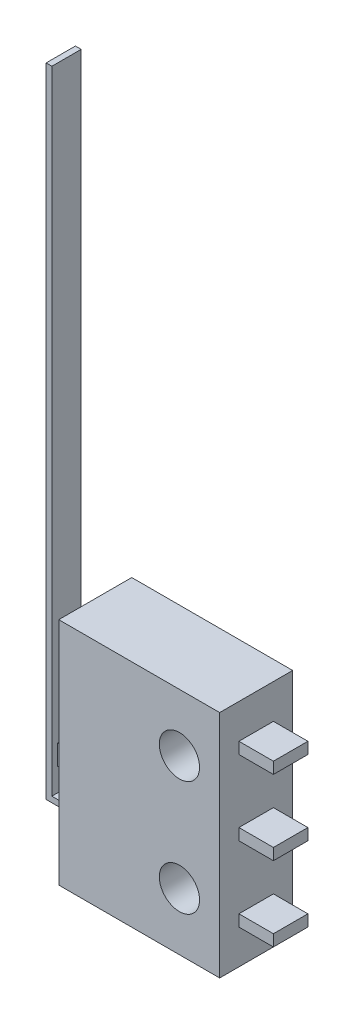
ISO-10303-21;
HEADER;
FILE_DESCRIPTION(('STEP AP214'),'2;1');
FILE_NAME('part.step','',(''),(''),'','','');
FILE_SCHEMA(('AUTOMOTIVE_DESIGN { 1 0 10303 214 1 1 1 1 }'));
ENDSEC;
DATA;
#1=APPLICATION_CONTEXT('core data for automotive mechanical design processes');
#2=APPLICATION_PROTOCOL_DEFINITION('international standard','automotive_design',2000,#1);
#3=PRODUCT_CONTEXT('',#1,'mechanical');
#4=PRODUCT('Part','Part','',(#3));
#5=PRODUCT_RELATED_PRODUCT_CATEGORY('part','',(#4));
#6=PRODUCT_DEFINITION_FORMATION('','',#4);
#7=PRODUCT_DEFINITION_CONTEXT('part definition',#1,'design');
#8=PRODUCT_DEFINITION('design','',#6,#7);
#9=PRODUCT_DEFINITION_SHAPE('','',#8);
#10=(LENGTH_UNIT() NAMED_UNIT(*) SI_UNIT(.MILLI.,.METRE.));
#11=(NAMED_UNIT(*) PLANE_ANGLE_UNIT() SI_UNIT($,.RADIAN.));
#12=(NAMED_UNIT(*) SI_UNIT($,.STERADIAN.) SOLID_ANGLE_UNIT());
#13=UNCERTAINTY_MEASURE_WITH_UNIT(LENGTH_MEASURE(1.E-05),#10,'distance_accuracy_value','');
#14=(GEOMETRIC_REPRESENTATION_CONTEXT(3) GLOBAL_UNCERTAINTY_ASSIGNED_CONTEXT((#13)) GLOBAL_UNIT_ASSIGNED_CONTEXT((#10,
#11,#12)) REPRESENTATION_CONTEXT('',''));
#15=CARTESIAN_POINT('',(0.,0.,0.));
#16=DIRECTION('',(0.,0.,1.));
#17=DIRECTION('',(1.,0.,0.));
#18=AXIS2_PLACEMENT_3D('',#15,#16,#17);
#19=CARTESIAN_POINT('',(14.,0.,-6.35));
#20=DIRECTION('',(1.,0.,0.));
#21=DIRECTION('',(0.,0.,-1.));
#22=AXIS2_PLACEMENT_3D('',#19,#20,#21);
#23=PLANE('',#22);
#24=DIRECTION('',(0.,1.,0.));
#25=VECTOR('',#24,1.);
#26=CARTESIAN_POINT('',(14.,0.,0.));
#27=LINE('',#26,#25);
#28=CARTESIAN_POINT('',(14.,0.,0.));
#29=VERTEX_POINT('',#28);
#30=CARTESIAN_POINT('',(14.,20.,0.));
#31=VERTEX_POINT('',#30);
#32=EDGE_CURVE('E456',#29,#31,#27,.T.);
#33=ORIENTED_EDGE('',*,*,#32,.F.);
#34=DIRECTION('',(0.,0.,1.));
#35=VECTOR('',#34,1.);
#36=CARTESIAN_POINT('',(14.,0.,-6.35));
#37=LINE('',#36,#35);
#38=CARTESIAN_POINT('',(14.,0.,-6.35));
#39=VERTEX_POINT('',#38);
#40=EDGE_CURVE('E464',#39,#29,#37,.T.);
#41=ORIENTED_EDGE('',*,*,#40,.F.);
#42=DIRECTION('',(0.,1.,0.));
#43=VECTOR('',#42,1.);
#44=CARTESIAN_POINT('',(14.,0.,-6.35));
#45=LINE('',#44,#43);
#46=CARTESIAN_POINT('',(14.,20.,-6.35));
#47=VERTEX_POINT('',#46);
#48=EDGE_CURVE('E441',#39,#47,#45,.T.);
#49=ORIENTED_EDGE('',*,*,#48,.T.);
#50=DIRECTION('',(0.,0.,1.));
#51=VECTOR('',#50,1.);
#52=CARTESIAN_POINT('',(14.,20.,-6.35));
#53=LINE('',#52,#51);
#54=EDGE_CURVE('E49',#47,#31,#53,.T.);
#55=ORIENTED_EDGE('',*,*,#54,.T.);
#56=EDGE_LOOP('',(#33,#41,#49,#55));
#57=FACE_BOUND('',#56,.T.);
#58=DIRECTION('',(0.,0.,1.));
#59=VECTOR('',#58,1.);
#60=CARTESIAN_POINT('',(14.,4.,-1.675));
#61=LINE('',#60,#59);
#62=CARTESIAN_POINT('',(14.,4.,-4.675));
#63=VERTEX_POINT('',#62);
#64=CARTESIAN_POINT('',(14.,4.,-1.675));
#65=VERTEX_POINT('',#64);
#66=EDGE_CURVE('E306',#63,#65,#61,.T.);
#67=ORIENTED_EDGE('',*,*,#66,.F.);
#68=DIRECTION('',(0.,1.,0.));
#69=VECTOR('',#68,1.);
#70=CARTESIAN_POINT('',(14.,4.,-4.675));
#71=LINE('',#70,#69);
#72=CARTESIAN_POINT('',(14.,3.,-4.675));
#73=VERTEX_POINT('',#72);
#74=EDGE_CURVE('E287',#73,#63,#71,.T.);
#75=ORIENTED_EDGE('',*,*,#74,.F.);
#76=DIRECTION('',(0.,0.,-1.));
#77=VECTOR('',#76,1.);
#78=CARTESIAN_POINT('',(14.,3.,-1.675));
#79=LINE('',#78,#77);
#80=CARTESIAN_POINT('',(14.,3.,-1.675));
#81=VERTEX_POINT('',#80);
#82=EDGE_CURVE('E293',#81,#73,#79,.T.);
#83=ORIENTED_EDGE('',*,*,#82,.F.);
#84=DIRECTION('',(0.,-1.,0.));
#85=VECTOR('',#84,1.);
#86=CARTESIAN_POINT('',(14.,4.,-1.675));
#87=LINE('',#86,#85);
#88=EDGE_CURVE('E309',#65,#81,#87,.T.);
#89=ORIENTED_EDGE('',*,*,#88,.F.);
#90=EDGE_LOOP('',(#67,#75,#83,#89));
#91=FACE_BOUND('',#90,.T.);
#92=DIRECTION('',(0.,0.,1.));
#93=VECTOR('',#92,1.);
#94=CARTESIAN_POINT('',(14.,10.5,-1.675));
#95=LINE('',#94,#93);
#96=CARTESIAN_POINT('',(14.,10.5,-4.675));
#97=VERTEX_POINT('',#96);
#98=CARTESIAN_POINT('',(14.,10.5,-1.675));
#99=VERTEX_POINT('',#98);
#100=EDGE_CURVE('E248',#97,#99,#95,.T.);
#101=ORIENTED_EDGE('',*,*,#100,.F.);
#102=DIRECTION('',(0.,1.,0.));
#103=VECTOR('',#102,1.);
#104=CARTESIAN_POINT('',(14.,10.5,-4.675));
#105=LINE('',#104,#103);
#106=CARTESIAN_POINT('',(14.,9.5,-4.675));
#107=VERTEX_POINT('',#106);
#108=EDGE_CURVE('E243',#107,#97,#105,.T.);
#109=ORIENTED_EDGE('',*,*,#108,.F.);
#110=DIRECTION('',(0.,0.,-1.));
#111=VECTOR('',#110,1.);
#112=CARTESIAN_POINT('',(14.,9.5,-1.675));
#113=LINE('',#112,#111);
#114=CARTESIAN_POINT('',(14.,9.5,-1.675));
#115=VERTEX_POINT('',#114);
#116=EDGE_CURVE('E258',#115,#107,#113,.T.);
#117=ORIENTED_EDGE('',*,*,#116,.F.);
#118=DIRECTION('',(0.,-1.,0.));
#119=VECTOR('',#118,1.);
#120=CARTESIAN_POINT('',(14.,10.5,-1.675));
#121=LINE('',#120,#119);
#122=EDGE_CURVE('E270',#99,#115,#121,.T.);
#123=ORIENTED_EDGE('',*,*,#122,.F.);
#124=EDGE_LOOP('',(#101,#109,#117,#123));
#125=FACE_BOUND('',#124,.T.);
#126=DIRECTION('',(0.,0.,1.));
#127=VECTOR('',#126,1.);
#128=CARTESIAN_POINT('',(14.,17.,-1.675));
#129=LINE('',#128,#127);
#130=CARTESIAN_POINT('',(14.,17.,-4.675));
#131=VERTEX_POINT('',#130);
#132=CARTESIAN_POINT('',(14.,17.,-1.675));
#133=VERTEX_POINT('',#132);
#134=EDGE_CURVE('E499',#131,#133,#129,.T.);
#135=ORIENTED_EDGE('',*,*,#134,.F.);
#136=DIRECTION('',(0.,1.,0.));
#137=VECTOR('',#136,1.);
#138=CARTESIAN_POINT('',(14.,17.,-4.675));
#139=LINE('',#138,#137);
#140=CARTESIAN_POINT('',(14.,16.,-4.675));
#141=VERTEX_POINT('',#140);
#142=EDGE_CURVE('E240',#141,#131,#139,.T.);
#143=ORIENTED_EDGE('',*,*,#142,.F.);
#144=DIRECTION('',(0.,0.,-1.));
#145=VECTOR('',#144,1.);
#146=CARTESIAN_POINT('',(14.,16.,-1.675));
#147=LINE('',#146,#145);
#148=CARTESIAN_POINT('',(14.,16.,-1.675));
#149=VERTEX_POINT('',#148);
#150=EDGE_CURVE('E236',#149,#141,#147,.T.);
#151=ORIENTED_EDGE('',*,*,#150,.F.);
#152=DIRECTION('',(0.,-1.,0.));
#153=VECTOR('',#152,1.);
#154=CARTESIAN_POINT('',(14.,17.,-1.675));
#155=LINE('',#154,#153);
#156=EDGE_CURVE('E501',#133,#149,#155,.T.);
#157=ORIENTED_EDGE('',*,*,#156,.F.);
#158=EDGE_LOOP('',(#135,#143,#151,#157));
#159=FACE_BOUND('',#158,.T.);
#160=ADVANCED_FACE('F39',(#57,#91,#125,#159),#23,.T.);
#161=CARTESIAN_POINT('',(-3.,4.5,-4.45));
#162=DIRECTION('',(0.,-1.,0.));
#163=DIRECTION('',(0.,0.,-1.));
#164=AXIS2_PLACEMENT_3D('',#161,#162,#163);
#165=PLANE('',#164);
#166=DIRECTION('',(0.,0.,-1.));
#167=VECTOR('',#166,1.);
#168=CARTESIAN_POINT('',(-2.5,4.5,-4.45));
#169=LINE('',#168,#167);
#170=CARTESIAN_POINT('',(-2.5,4.5,-1.9));
#171=VERTEX_POINT('',#170);
#172=CARTESIAN_POINT('',(-2.5,4.5,-4.45));
#173=VERTEX_POINT('',#172);
#174=EDGE_CURVE('E328',#171,#173,#169,.T.);
#175=ORIENTED_EDGE('',*,*,#174,.F.);
#176=DIRECTION('',(1.,0.,0.));
#177=VECTOR('',#176,1.);
#178=CARTESIAN_POINT('',(-3.,4.5,-1.9));
#179=LINE('',#178,#177);
#180=CARTESIAN_POINT('',(0.,4.5,-1.9));
#181=VERTEX_POINT('',#180);
#182=EDGE_CURVE('E380',#171,#181,#179,.T.);
#183=ORIENTED_EDGE('',*,*,#182,.T.);
#184=DIRECTION('',(0.,0.,-1.));
#185=VECTOR('',#184,1.);
#186=CARTESIAN_POINT('',(0.,4.5,-4.45));
#187=LINE('',#186,#185);
#188=CARTESIAN_POINT('',(0.,4.5,-4.45));
#189=VERTEX_POINT('',#188);
#190=EDGE_CURVE('E358',#181,#189,#187,.T.);
#191=ORIENTED_EDGE('',*,*,#190,.T.);
#192=DIRECTION('',(1.,0.,0.));
#193=VECTOR('',#192,1.);
#194=CARTESIAN_POINT('',(-3.,4.5,-4.45));
#195=LINE('',#194,#193);
#196=EDGE_CURVE('E364',#173,#189,#195,.T.);
#197=ORIENTED_EDGE('',*,*,#196,.F.);
#198=EDGE_LOOP('',(#175,#183,#191,#197));
#199=FACE_BOUND('',#198,.T.);
#200=ADVANCED_FACE('F488',(#199),#165,.F.);
#201=CARTESIAN_POINT('',(0.,0.,-6.35));
#202=DIRECTION('',(-1.,0.,0.));
#203=DIRECTION('',(0.,0.,1.));
#204=AXIS2_PLACEMENT_3D('',#201,#202,#203);
#205=PLANE('',#204);
#206=DIRECTION('',(0.,-1.,0.));
#207=VECTOR('',#206,1.);
#208=CARTESIAN_POINT('',(0.,0.,0.));
#209=LINE('',#208,#207);
#210=CARTESIAN_POINT('',(0.,20.,0.));
#211=VERTEX_POINT('',#210);
#212=CARTESIAN_POINT('',(0.,0.,0.));
#213=VERTEX_POINT('',#212);
#214=EDGE_CURVE('E431',#211,#213,#209,.T.);
#215=ORIENTED_EDGE('',*,*,#214,.F.);
#216=DIRECTION('',(0.,0.,1.));
#217=VECTOR('',#216,1.);
#218=CARTESIAN_POINT('',(0.,20.,-6.35));
#219=LINE('',#218,#217);
#220=CARTESIAN_POINT('',(0.,20.,-6.35));
#221=VERTEX_POINT('',#220);
#222=EDGE_CURVE('E11',#221,#211,#219,.T.);
#223=ORIENTED_EDGE('',*,*,#222,.F.);
#224=DIRECTION('',(0.,-1.,0.));
#225=VECTOR('',#224,1.);
#226=CARTESIAN_POINT('',(0.,0.,-6.35));
#227=LINE('',#226,#225);
#228=CARTESIAN_POINT('',(0.,0.,-6.35));
#229=VERTEX_POINT('',#228);
#230=EDGE_CURVE('E432',#221,#229,#227,.T.);
#231=ORIENTED_EDGE('',*,*,#230,.T.);
#232=DIRECTION('',(0.,0.,1.));
#233=VECTOR('',#232,1.);
#234=CARTESIAN_POINT('',(0.,0.,-6.35));
#235=LINE('',#234,#233);
#236=EDGE_CURVE('E43',#229,#213,#235,.T.);
#237=ORIENTED_EDGE('',*,*,#236,.T.);
#238=EDGE_LOOP('',(#215,#223,#231,#237));
#239=FACE_BOUND('',#238,.T.);
#240=DIRECTION('',(0.,0.,1.));
#241=VECTOR('',#240,1.);
#242=CARTESIAN_POINT('',(0.,7.,-4.45));
#243=LINE('',#242,#241);
#244=CARTESIAN_POINT('',(0.,7.,-4.45));
#245=VERTEX_POINT('',#244);
#246=CARTESIAN_POINT('',(0.,7.,-1.9));
#247=VERTEX_POINT('',#246);
#248=EDGE_CURVE('E409',#245,#247,#243,.T.);
#249=ORIENTED_EDGE('',*,*,#248,.F.);
#250=DIRECTION('',(0.,-1.,0.));
#251=VECTOR('',#250,1.);
#252=CARTESIAN_POINT('',(0.,7.,-4.45));
#253=LINE('',#252,#251);
#254=CARTESIAN_POINT('',(0.,8.75416537948826,-4.45));
#255=VERTEX_POINT('',#254);
#256=EDGE_CURVE('E390',#255,#245,#253,.T.);
#257=ORIENTED_EDGE('',*,*,#256,.F.);
#258=DIRECTION('',(0.,0.,-1.));
#259=VECTOR('',#258,1.);
#260=CARTESIAN_POINT('',(0.,8.75416537948826,-4.45));
#261=LINE('',#260,#259);
#262=CARTESIAN_POINT('',(0.,8.75416537948826,-1.9));
#263=VERTEX_POINT('',#262);
#264=EDGE_CURVE('E396',#263,#255,#261,.T.);
#265=ORIENTED_EDGE('',*,*,#264,.F.);
#266=DIRECTION('',(0.,1.,0.));
#267=VECTOR('',#266,1.);
#268=CARTESIAN_POINT('',(0.,7.,-1.9));
#269=LINE('',#268,#267);
#270=EDGE_CURVE('E412',#247,#263,#269,.T.);
#271=ORIENTED_EDGE('',*,*,#270,.F.);
#272=EDGE_LOOP('',(#249,#257,#265,#271));
#273=FACE_BOUND('',#272,.T.);
#274=DIRECTION('',(0.,0.,1.));
#275=VECTOR('',#274,1.);
#276=CARTESIAN_POINT('',(0.,4.,-4.45));
#277=LINE('',#276,#275);
#278=CARTESIAN_POINT('',(0.,4.,-4.45));
#279=VERTEX_POINT('',#278);
#280=CARTESIAN_POINT('',(0.,4.,-1.9));
#281=VERTEX_POINT('',#280);
#282=EDGE_CURVE('E368',#279,#281,#277,.T.);
#283=ORIENTED_EDGE('',*,*,#282,.F.);
#284=DIRECTION('',(0.,-1.,0.));
#285=VECTOR('',#284,1.);
#286=CARTESIAN_POINT('',(0.,4.,-4.45));
#287=LINE('',#286,#285);
#288=EDGE_CURVE('E352',#189,#279,#287,.T.);
#289=ORIENTED_EDGE('',*,*,#288,.F.);
#290=ORIENTED_EDGE('',*,*,#190,.F.);
#291=DIRECTION('',(0.,1.,0.));
#292=VECTOR('',#291,1.);
#293=CARTESIAN_POINT('',(0.,4.,-1.9));
#294=LINE('',#293,#292);
#295=EDGE_CURVE('E371',#281,#181,#294,.T.);
#296=ORIENTED_EDGE('',*,*,#295,.F.);
#297=EDGE_LOOP('',(#283,#289,#290,#296));
#298=FACE_BOUND('',#297,.T.);
#299=ADVANCED_FACE('F41',(#239,#273,#298),#205,.T.);
#300=CARTESIAN_POINT('',(0.,20.,-6.35));
#301=DIRECTION('',(0.,1.,0.));
#302=DIRECTION('',(0.,0.,1.));
#303=AXIS2_PLACEMENT_3D('',#300,#301,#302);
#304=PLANE('',#303);
#305=DIRECTION('',(-1.,0.,0.));
#306=VECTOR('',#305,1.);
#307=CARTESIAN_POINT('',(0.,20.,0.));
#308=LINE('',#307,#306);
#309=EDGE_CURVE('E437',#31,#211,#308,.T.);
#310=ORIENTED_EDGE('',*,*,#309,.F.);
#311=ORIENTED_EDGE('',*,*,#54,.F.);
#312=DIRECTION('',(-1.,0.,0.));
#313=VECTOR('',#312,1.);
#314=CARTESIAN_POINT('',(0.,20.,-6.35));
#315=LINE('',#314,#313);
#316=EDGE_CURVE('E445',#47,#221,#315,.T.);
#317=ORIENTED_EDGE('',*,*,#316,.T.);
#318=ORIENTED_EDGE('',*,*,#222,.T.);
#319=EDGE_LOOP('',(#310,#311,#317,#318));
#320=FACE_BOUND('',#319,.T.);
#321=ADVANCED_FACE('F480',(#320),#304,.T.);
#322=CARTESIAN_POINT('',(0.,0.,-6.35));
#323=DIRECTION('',(0.,-1.,0.));
#324=DIRECTION('',(0.,0.,-1.));
#325=AXIS2_PLACEMENT_3D('',#322,#323,#324);
#326=PLANE('',#325);
#327=DIRECTION('',(1.,0.,0.));
#328=VECTOR('',#327,1.);
#329=CARTESIAN_POINT('',(0.,0.,0.));
#330=LINE('',#329,#328);
#331=EDGE_CURVE('E452',#213,#29,#330,.T.);
#332=ORIENTED_EDGE('',*,*,#331,.F.);
#333=ORIENTED_EDGE('',*,*,#236,.F.);
#334=DIRECTION('',(1.,0.,0.));
#335=VECTOR('',#334,1.);
#336=CARTESIAN_POINT('',(0.,0.,-6.35));
#337=LINE('',#336,#335);
#338=EDGE_CURVE('E436',#229,#39,#337,.T.);
#339=ORIENTED_EDGE('',*,*,#338,.T.);
#340=ORIENTED_EDGE('',*,*,#40,.T.);
#341=EDGE_LOOP('',(#332,#333,#339,#340));
#342=FACE_BOUND('',#341,.T.);
#343=ADVANCED_FACE('F475',(#342),#326,.T.);
#344=CARTESIAN_POINT('',(0.,0.,-6.35));
#345=DIRECTION('',(0.,0.,-1.));
#346=DIRECTION('',(-1.,0.,0.));
#347=AXIS2_PLACEMENT_3D('',#344,#345,#346);
#348=PLANE('',#347);
#349=CARTESIAN_POINT('',(10.5,15.,-6.35));
#350=DIRECTION('',(0.,0.,1.));
#351=DIRECTION('',(1.,0.,0.));
#352=AXIS2_PLACEMENT_3D('',#349,#350,#351);
#353=CIRCLE('',#352,1.74999999999999);
#354=CARTESIAN_POINT('',(12.25,15.,-6.35));
#355=VERTEX_POINT('',#354);
#356=EDGE_CURVE('E527',#355,#355,#353,.T.);
#357=ORIENTED_EDGE('',*,*,#356,.T.);
#358=EDGE_LOOP('',(#357));
#359=FACE_BOUND('',#358,.T.);
#360=CARTESIAN_POINT('',(10.5,5.,-6.35));
#361=DIRECTION('',(0.,0.,1.));
#362=DIRECTION('',(1.,0.,0.));
#363=AXIS2_PLACEMENT_3D('',#360,#361,#362);
#364=CIRCLE('',#363,1.74999999999999);
#365=CARTESIAN_POINT('',(12.25,5.,-6.35));
#366=VERTEX_POINT('',#365);
#367=EDGE_CURVE('E507',#366,#366,#364,.T.);
#368=ORIENTED_EDGE('',*,*,#367,.T.);
#369=EDGE_LOOP('',(#368));
#370=FACE_BOUND('',#369,.T.);
#371=ORIENTED_EDGE('',*,*,#230,.F.);
#372=ORIENTED_EDGE('',*,*,#316,.F.);
#373=ORIENTED_EDGE('',*,*,#48,.F.);
#374=ORIENTED_EDGE('',*,*,#338,.F.);
#375=EDGE_LOOP('',(#371,#372,#373,#374));
#376=FACE_BOUND('',#375,.T.);
#377=ADVANCED_FACE('F483',(#359,#370,#376),#348,.T.);
#378=CARTESIAN_POINT('',(0.,0.,0.));
#379=DIRECTION('',(0.,0.,-1.));
#380=DIRECTION('',(-1.,0.,0.));
#381=AXIS2_PLACEMENT_3D('',#378,#379,#380);
#382=PLANE('',#381);
#383=CARTESIAN_POINT('',(10.5,15.,0.));
#384=DIRECTION('',(0.,0.,1.));
#385=DIRECTION('',(1.,0.,0.));
#386=AXIS2_PLACEMENT_3D('',#383,#384,#385);
#387=CIRCLE('',#386,1.74999999999999);
#388=CARTESIAN_POINT('',(12.25,15.,0.));
#389=VERTEX_POINT('',#388);
#390=EDGE_CURVE('E531',#389,#389,#387,.T.);
#391=ORIENTED_EDGE('',*,*,#390,.F.);
#392=EDGE_LOOP('',(#391));
#393=FACE_BOUND('',#392,.T.);
#394=CARTESIAN_POINT('',(10.5,5.,0.));
#395=DIRECTION('',(0.,0.,1.));
#396=DIRECTION('',(1.,0.,0.));
#397=AXIS2_PLACEMENT_3D('',#394,#395,#396);
#398=CIRCLE('',#397,1.74999999999999);
#399=CARTESIAN_POINT('',(12.25,5.,0.));
#400=VERTEX_POINT('',#399);
#401=EDGE_CURVE('E523',#400,#400,#398,.T.);
#402=ORIENTED_EDGE('',*,*,#401,.F.);
#403=EDGE_LOOP('',(#402));
#404=FACE_BOUND('',#403,.T.);
#405=ORIENTED_EDGE('',*,*,#214,.T.);
#406=ORIENTED_EDGE('',*,*,#331,.T.);
#407=ORIENTED_EDGE('',*,*,#32,.T.);
#408=ORIENTED_EDGE('',*,*,#309,.T.);
#409=EDGE_LOOP('',(#405,#406,#407,#408));
#410=FACE_BOUND('',#409,.T.);
#411=ADVANCED_FACE('F477',(#393,#404,#410),#382,.F.);
#412=CARTESIAN_POINT('',(-2.,7.,-4.45));
#413=DIRECTION('',(0.,0.,1.));
#414=DIRECTION('',(1.,0.,0.));
#415=AXIS2_PLACEMENT_3D('',#412,#413,#414);
#416=PLANE('',#415);
#417=ORIENTED_EDGE('',*,*,#256,.T.);
#418=DIRECTION('',(1.,0.,0.));
#419=VECTOR('',#418,1.);
#420=CARTESIAN_POINT('',(-2.,7.,-4.45));
#421=LINE('',#420,#419);
#422=CARTESIAN_POINT('',(-2.,7.,-4.45));
#423=VERTEX_POINT('',#422);
#424=EDGE_CURVE('E428',#423,#245,#421,.T.);
#425=ORIENTED_EDGE('',*,*,#424,.F.);
#426=DIRECTION('',(0.,-1.,0.));
#427=VECTOR('',#426,1.);
#428=CARTESIAN_POINT('',(-2.,7.,-4.45));
#429=LINE('',#428,#427);
#430=CARTESIAN_POINT('',(-2.,8.75416537948826,-4.45));
#431=VERTEX_POINT('',#430);
#432=EDGE_CURVE('E391',#431,#423,#429,.T.);
#433=ORIENTED_EDGE('',*,*,#432,.F.);
#434=DIRECTION('',(1.,0.,0.));
#435=VECTOR('',#434,1.);
#436=CARTESIAN_POINT('',(-2.,8.75416537948826,-4.45));
#437=LINE('',#436,#435);
#438=EDGE_CURVE('E405',#431,#255,#437,.T.);
#439=ORIENTED_EDGE('',*,*,#438,.T.);
#440=EDGE_LOOP('',(#417,#425,#433,#439));
#441=FACE_BOUND('',#440,.T.);
#442=ADVANCED_FACE('F540',(#441),#416,.F.);
#443=CARTESIAN_POINT('',(-2.,7.,-4.45));
#444=DIRECTION('',(0.,1.,0.));
#445=DIRECTION('',(0.,0.,1.));
#446=AXIS2_PLACEMENT_3D('',#443,#444,#445);
#447=PLANE('',#446);
#448=ORIENTED_EDGE('',*,*,#248,.T.);
#449=DIRECTION('',(1.,0.,0.));
#450=VECTOR('',#449,1.);
#451=CARTESIAN_POINT('',(-2.,7.,-1.9));
#452=LINE('',#451,#450);
#453=CARTESIAN_POINT('',(-2.,7.,-1.9));
#454=VERTEX_POINT('',#453);
#455=EDGE_CURVE('E424',#454,#247,#452,.T.);
#456=ORIENTED_EDGE('',*,*,#455,.F.);
#457=DIRECTION('',(0.,0.,1.));
#458=VECTOR('',#457,1.);
#459=CARTESIAN_POINT('',(-2.,7.,-4.45));
#460=LINE('',#459,#458);
#461=EDGE_CURVE('E395',#423,#454,#460,.T.);
#462=ORIENTED_EDGE('',*,*,#461,.F.);
#463=ORIENTED_EDGE('',*,*,#424,.T.);
#464=EDGE_LOOP('',(#448,#456,#462,#463));
#465=FACE_BOUND('',#464,.T.);
#466=ADVANCED_FACE('F645',(#465),#447,.F.);
#467=CARTESIAN_POINT('',(-2.,7.,-1.9));
#468=DIRECTION('',(0.,0.,-1.));
#469=DIRECTION('',(-1.,0.,0.));
#470=AXIS2_PLACEMENT_3D('',#467,#468,#469);
#471=PLANE('',#470);
#472=ORIENTED_EDGE('',*,*,#270,.T.);
#473=DIRECTION('',(1.,0.,0.));
#474=VECTOR('',#473,1.);
#475=CARTESIAN_POINT('',(-2.,8.75416537948826,-1.9));
#476=LINE('',#475,#474);
#477=CARTESIAN_POINT('',(-2.,8.75416537948826,-1.9));
#478=VERTEX_POINT('',#477);
#479=EDGE_CURVE('E421',#478,#263,#476,.T.);
#480=ORIENTED_EDGE('',*,*,#479,.F.);
#481=DIRECTION('',(0.,1.,0.));
#482=VECTOR('',#481,1.);
#483=CARTESIAN_POINT('',(-2.,7.,-1.9));
#484=LINE('',#483,#482);
#485=EDGE_CURVE('E399',#454,#478,#484,.T.);
#486=ORIENTED_EDGE('',*,*,#485,.F.);
#487=ORIENTED_EDGE('',*,*,#455,.T.);
#488=EDGE_LOOP('',(#472,#480,#486,#487));
#489=FACE_BOUND('',#488,.T.);
#490=ADVANCED_FACE('F641',(#489),#471,.F.);
#491=CARTESIAN_POINT('',(-2.,8.75416537948826,-4.45));
#492=DIRECTION('',(0.,-1.,0.));
#493=DIRECTION('',(0.,0.,-1.));
#494=AXIS2_PLACEMENT_3D('',#491,#492,#493);
#495=PLANE('',#494);
#496=ORIENTED_EDGE('',*,*,#264,.T.);
#497=ORIENTED_EDGE('',*,*,#438,.F.);
#498=DIRECTION('',(0.,0.,-1.));
#499=VECTOR('',#498,1.);
#500=CARTESIAN_POINT('',(-2.,8.75416537948826,-4.45));
#501=LINE('',#500,#499);
#502=EDGE_CURVE('E402',#478,#431,#501,.T.);
#503=ORIENTED_EDGE('',*,*,#502,.F.);
#504=ORIENTED_EDGE('',*,*,#479,.T.);
#505=EDGE_LOOP('',(#496,#497,#503,#504));
#506=FACE_BOUND('',#505,.T.);
#507=ADVANCED_FACE('F637',(#506),#495,.F.);
#508=CARTESIAN_POINT('',(-2.,0.,0.));
#509=DIRECTION('',(1.,0.,0.));
#510=DIRECTION('',(0.,0.,-1.));
#511=AXIS2_PLACEMENT_3D('',#508,#509,#510);
#512=PLANE('',#511);
#513=ORIENTED_EDGE('',*,*,#432,.T.);
#514=ORIENTED_EDGE('',*,*,#461,.T.);
#515=ORIENTED_EDGE('',*,*,#485,.T.);
#516=ORIENTED_EDGE('',*,*,#502,.T.);
#517=EDGE_LOOP('',(#513,#514,#515,#516));
#518=FACE_BOUND('',#517,.T.);
#519=ADVANCED_FACE('F633',(#518),#512,.F.);
#520=CARTESIAN_POINT('',(-3.,4.,-4.45));
#521=DIRECTION('',(0.,0.,1.));
#522=DIRECTION('',(1.,0.,0.));
#523=AXIS2_PLACEMENT_3D('',#520,#521,#522);
#524=PLANE('',#523);
#525=ORIENTED_EDGE('',*,*,#288,.T.);
#526=DIRECTION('',(1.,0.,0.));
#527=VECTOR('',#526,1.);
#528=CARTESIAN_POINT('',(-3.,4.,-4.45));
#529=LINE('',#528,#527);
#530=CARTESIAN_POINT('',(-3.,4.,-4.45));
#531=VERTEX_POINT('',#530);
#532=EDGE_CURVE('E387',#531,#279,#529,.T.);
#533=ORIENTED_EDGE('',*,*,#532,.F.);
#534=DIRECTION('',(0.,-1.,0.));
#535=VECTOR('',#534,1.);
#536=CARTESIAN_POINT('',(-3.,4.,-4.45));
#537=LINE('',#536,#535);
#538=CARTESIAN_POINT('',(-3.,59.5,-4.45));
#539=VERTEX_POINT('',#538);
#540=EDGE_CURVE('E353',#539,#531,#537,.T.);
#541=ORIENTED_EDGE('',*,*,#540,.F.);
#542=DIRECTION('',(-1.,0.,0.));
#543=VECTOR('',#542,1.);
#544=CARTESIAN_POINT('',(-3.,59.5,-4.45));
#545=LINE('',#544,#543);
#546=CARTESIAN_POINT('',(-2.5,59.5,-4.45));
#547=VERTEX_POINT('',#546);
#548=EDGE_CURVE('E339',#547,#539,#545,.T.);
#549=ORIENTED_EDGE('',*,*,#548,.F.);
#550=DIRECTION('',(0.,-1.,0.));
#551=VECTOR('',#550,1.);
#552=CARTESIAN_POINT('',(-2.5,59.5,-4.45));
#553=LINE('',#552,#551);
#554=EDGE_CURVE('E343',#547,#173,#553,.T.);
#555=ORIENTED_EDGE('',*,*,#554,.T.);
#556=ORIENTED_EDGE('',*,*,#196,.T.);
#557=EDGE_LOOP('',(#525,#533,#541,#549,#555,#556));
#558=FACE_BOUND('',#557,.T.);
#559=ADVANCED_FACE('F629',(#558),#524,.F.);
#560=CARTESIAN_POINT('',(-3.,4.,-4.45));
#561=DIRECTION('',(0.,1.,0.));
#562=DIRECTION('',(0.,0.,1.));
#563=AXIS2_PLACEMENT_3D('',#560,#561,#562);
#564=PLANE('',#563);
#565=ORIENTED_EDGE('',*,*,#282,.T.);
#566=DIRECTION('',(1.,0.,0.));
#567=VECTOR('',#566,1.);
#568=CARTESIAN_POINT('',(-3.,4.,-1.9));
#569=LINE('',#568,#567);
#570=CARTESIAN_POINT('',(-3.,4.,-1.9));
#571=VERTEX_POINT('',#570);
#572=EDGE_CURVE('E383',#571,#281,#569,.T.);
#573=ORIENTED_EDGE('',*,*,#572,.F.);
#574=DIRECTION('',(0.,0.,1.));
#575=VECTOR('',#574,1.);
#576=CARTESIAN_POINT('',(-3.,4.,-4.45));
#577=LINE('',#576,#575);
#578=EDGE_CURVE('E357',#531,#571,#577,.T.);
#579=ORIENTED_EDGE('',*,*,#578,.F.);
#580=ORIENTED_EDGE('',*,*,#532,.T.);
#581=EDGE_LOOP('',(#565,#573,#579,#580));
#582=FACE_BOUND('',#581,.T.);
#583=ADVANCED_FACE('F625',(#582),#564,.F.);
#584=CARTESIAN_POINT('',(-3.,4.,-1.9));
#585=DIRECTION('',(0.,0.,-1.));
#586=DIRECTION('',(-1.,0.,0.));
#587=AXIS2_PLACEMENT_3D('',#584,#585,#586);
#588=PLANE('',#587);
#589=ORIENTED_EDGE('',*,*,#295,.T.);
#590=ORIENTED_EDGE('',*,*,#182,.F.);
#591=DIRECTION('',(0.,-1.,0.));
#592=VECTOR('',#591,1.);
#593=CARTESIAN_POINT('',(-2.5,59.5,-1.9));
#594=LINE('',#593,#592);
#595=CARTESIAN_POINT('',(-2.5,59.5,-1.9));
#596=VERTEX_POINT('',#595);
#597=EDGE_CURVE('E349',#596,#171,#594,.T.);
#598=ORIENTED_EDGE('',*,*,#597,.F.);
#599=DIRECTION('',(1.,0.,0.));
#600=VECTOR('',#599,1.);
#601=CARTESIAN_POINT('',(-3.,59.5,-1.9));
#602=LINE('',#601,#600);
#603=CARTESIAN_POINT('',(-3.,59.5,-1.9));
#604=VERTEX_POINT('',#603);
#605=EDGE_CURVE('E333',#604,#596,#602,.T.);
#606=ORIENTED_EDGE('',*,*,#605,.F.);
#607=DIRECTION('',(0.,1.,0.));
#608=VECTOR('',#607,1.);
#609=CARTESIAN_POINT('',(-3.,4.,-1.9));
#610=LINE('',#609,#608);
#611=EDGE_CURVE('E361',#571,#604,#610,.T.);
#612=ORIENTED_EDGE('',*,*,#611,.F.);
#613=ORIENTED_EDGE('',*,*,#572,.T.);
#614=EDGE_LOOP('',(#589,#590,#598,#606,#612,#613));
#615=FACE_BOUND('',#614,.T.);
#616=ADVANCED_FACE('F618',(#615),#588,.F.);
#617=CARTESIAN_POINT('',(-3.,0.,0.));
#618=DIRECTION('',(1.,0.,0.));
#619=DIRECTION('',(0.,0.,-1.));
#620=AXIS2_PLACEMENT_3D('',#617,#618,#619);
#621=PLANE('',#620);
#622=ORIENTED_EDGE('',*,*,#540,.T.);
#623=ORIENTED_EDGE('',*,*,#578,.T.);
#624=ORIENTED_EDGE('',*,*,#611,.T.);
#625=DIRECTION('',(0.,0.,1.));
#626=VECTOR('',#625,1.);
#627=CARTESIAN_POINT('',(-3.,59.5,-4.45));
#628=LINE('',#627,#626);
#629=EDGE_CURVE('E329',#539,#604,#628,.T.);
#630=ORIENTED_EDGE('',*,*,#629,.F.);
#631=EDGE_LOOP('',(#622,#623,#624,#630));
#632=FACE_BOUND('',#631,.T.);
#633=ADVANCED_FACE('F614',(#632),#621,.F.);
#634=CARTESIAN_POINT('',(-2.5,59.5,-4.45));
#635=DIRECTION('',(-1.,0.,0.));
#636=DIRECTION('',(0.,0.,1.));
#637=AXIS2_PLACEMENT_3D('',#634,#635,#636);
#638=PLANE('',#637);
#639=ORIENTED_EDGE('',*,*,#174,.T.);
#640=ORIENTED_EDGE('',*,*,#554,.F.);
#641=DIRECTION('',(0.,0.,-1.));
#642=VECTOR('',#641,1.);
#643=CARTESIAN_POINT('',(-2.5,59.5,-4.45));
#644=LINE('',#643,#642);
#645=EDGE_CURVE('E336',#596,#547,#644,.T.);
#646=ORIENTED_EDGE('',*,*,#645,.F.);
#647=ORIENTED_EDGE('',*,*,#597,.T.);
#648=EDGE_LOOP('',(#639,#640,#646,#647));
#649=FACE_BOUND('',#648,.T.);
#650=ADVANCED_FACE('F610',(#649),#638,.F.);
#651=CARTESIAN_POINT('',(0.,59.5,0.));
#652=DIRECTION('',(0.,1.,0.));
#653=DIRECTION('',(0.,0.,1.));
#654=AXIS2_PLACEMENT_3D('',#651,#652,#653);
#655=PLANE('',#654);
#656=ORIENTED_EDGE('',*,*,#629,.T.);
#657=ORIENTED_EDGE('',*,*,#605,.T.);
#658=ORIENTED_EDGE('',*,*,#645,.T.);
#659=ORIENTED_EDGE('',*,*,#548,.T.);
#660=EDGE_LOOP('',(#656,#657,#658,#659));
#661=FACE_BOUND('',#660,.T.);
#662=ADVANCED_FACE('F606',(#661),#655,.T.);
#663=CARTESIAN_POINT('',(17.,4.,-4.675));
#664=DIRECTION('',(0.,0.,1.));
#665=DIRECTION('',(1.,0.,0.));
#666=AXIS2_PLACEMENT_3D('',#663,#664,#665);
#667=PLANE('',#666);
#668=ORIENTED_EDGE('',*,*,#74,.T.);
#669=DIRECTION('',(-1.,0.,0.));
#670=VECTOR('',#669,1.);
#671=CARTESIAN_POINT('',(17.,4.,-4.675));
#672=LINE('',#671,#670);
#673=CARTESIAN_POINT('',(17.,4.,-4.675));
#674=VERTEX_POINT('',#673);
#675=EDGE_CURVE('E325',#674,#63,#672,.T.);
#676=ORIENTED_EDGE('',*,*,#675,.F.);
#677=DIRECTION('',(0.,1.,0.));
#678=VECTOR('',#677,1.);
#679=CARTESIAN_POINT('',(17.,4.,-4.675));
#680=LINE('',#679,#678);
#681=CARTESIAN_POINT('',(17.,3.,-4.675));
#682=VERTEX_POINT('',#681);
#683=EDGE_CURVE('E288',#682,#674,#680,.T.);
#684=ORIENTED_EDGE('',*,*,#683,.F.);
#685=DIRECTION('',(-1.,0.,0.));
#686=VECTOR('',#685,1.);
#687=CARTESIAN_POINT('',(17.,3.,-4.675));
#688=LINE('',#687,#686);
#689=EDGE_CURVE('E302',#682,#73,#688,.T.);
#690=ORIENTED_EDGE('',*,*,#689,.T.);
#691=EDGE_LOOP('',(#668,#676,#684,#690));
#692=FACE_BOUND('',#691,.T.);
#693=ADVANCED_FACE('F602',(#692),#667,.F.);
#694=CARTESIAN_POINT('',(17.,4.,-1.675));
#695=DIRECTION('',(0.,-1.,0.));
#696=DIRECTION('',(0.,0.,-1.));
#697=AXIS2_PLACEMENT_3D('',#694,#695,#696);
#698=PLANE('',#697);
#699=ORIENTED_EDGE('',*,*,#66,.T.);
#700=DIRECTION('',(-1.,0.,0.));
#701=VECTOR('',#700,1.);
#702=CARTESIAN_POINT('',(17.,4.,-1.675));
#703=LINE('',#702,#701);
#704=CARTESIAN_POINT('',(17.,4.,-1.675));
#705=VERTEX_POINT('',#704);
#706=EDGE_CURVE('E321',#705,#65,#703,.T.);
#707=ORIENTED_EDGE('',*,*,#706,.F.);
#708=DIRECTION('',(0.,0.,1.));
#709=VECTOR('',#708,1.);
#710=CARTESIAN_POINT('',(17.,4.,-1.675));
#711=LINE('',#710,#709);
#712=EDGE_CURVE('E292',#674,#705,#711,.T.);
#713=ORIENTED_EDGE('',*,*,#712,.F.);
#714=ORIENTED_EDGE('',*,*,#675,.T.);
#715=EDGE_LOOP('',(#699,#707,#713,#714));
#716=FACE_BOUND('',#715,.T.);
#717=ADVANCED_FACE('F598',(#716),#698,.F.);
#718=CARTESIAN_POINT('',(17.,4.,-1.675));
#719=DIRECTION('',(0.,0.,-1.));
#720=DIRECTION('',(0.,1.,0.));
#721=AXIS2_PLACEMENT_3D('',#718,#719,#720);
#722=PLANE('',#721);
#723=ORIENTED_EDGE('',*,*,#88,.T.);
#724=DIRECTION('',(-1.,0.,0.));
#725=VECTOR('',#724,1.);
#726=CARTESIAN_POINT('',(17.,3.,-1.675));
#727=LINE('',#726,#725);
#728=CARTESIAN_POINT('',(17.,3.,-1.675));
#729=VERTEX_POINT('',#728);
#730=EDGE_CURVE('E318',#729,#81,#727,.T.);
#731=ORIENTED_EDGE('',*,*,#730,.F.);
#732=DIRECTION('',(0.,-1.,0.));
#733=VECTOR('',#732,1.);
#734=CARTESIAN_POINT('',(17.,4.,-1.675));
#735=LINE('',#734,#733);
#736=EDGE_CURVE('E296',#705,#729,#735,.T.);
#737=ORIENTED_EDGE('',*,*,#736,.F.);
#738=ORIENTED_EDGE('',*,*,#706,.T.);
#739=EDGE_LOOP('',(#723,#731,#737,#738));
#740=FACE_BOUND('',#739,.T.);
#741=ADVANCED_FACE('F594',(#740),#722,.F.);
#742=CARTESIAN_POINT('',(17.,3.,-1.675));
#743=DIRECTION('',(0.,1.,0.));
#744=DIRECTION('',(0.,0.,1.));
#745=AXIS2_PLACEMENT_3D('',#742,#743,#744);
#746=PLANE('',#745);
#747=ORIENTED_EDGE('',*,*,#82,.T.);
#748=ORIENTED_EDGE('',*,*,#689,.F.);
#749=DIRECTION('',(0.,0.,-1.));
#750=VECTOR('',#749,1.);
#751=CARTESIAN_POINT('',(17.,3.,-1.675));
#752=LINE('',#751,#750);
#753=EDGE_CURVE('E299',#729,#682,#752,.T.);
#754=ORIENTED_EDGE('',*,*,#753,.F.);
#755=ORIENTED_EDGE('',*,*,#730,.T.);
#756=EDGE_LOOP('',(#747,#748,#754,#755));
#757=FACE_BOUND('',#756,.T.);
#758=ADVANCED_FACE('F590',(#757),#746,.F.);
#759=CARTESIAN_POINT('',(17.,0.,0.));
#760=DIRECTION('',(1.,0.,0.));
#761=DIRECTION('',(0.,0.,-1.));
#762=AXIS2_PLACEMENT_3D('',#759,#760,#761);
#763=PLANE('',#762);
#764=ORIENTED_EDGE('',*,*,#683,.T.);
#765=ORIENTED_EDGE('',*,*,#712,.T.);
#766=ORIENTED_EDGE('',*,*,#736,.T.);
#767=ORIENTED_EDGE('',*,*,#753,.T.);
#768=EDGE_LOOP('',(#764,#765,#766,#767));
#769=FACE_BOUND('',#768,.T.);
#770=ADVANCED_FACE('F586',(#769),#763,.T.);
#771=CARTESIAN_POINT('',(17.,10.5,-4.675));
#772=DIRECTION('',(0.,0.,1.));
#773=DIRECTION('',(1.,0.,0.));
#774=AXIS2_PLACEMENT_3D('',#771,#772,#773);
#775=PLANE('',#774);
#776=ORIENTED_EDGE('',*,*,#108,.T.);
#777=DIRECTION('',(-1.,0.,0.));
#778=VECTOR('',#777,1.);
#779=CARTESIAN_POINT('',(17.,10.5,-4.675));
#780=LINE('',#779,#778);
#781=CARTESIAN_POINT('',(17.,10.5,-4.675));
#782=VERTEX_POINT('',#781);
#783=EDGE_CURVE('E284',#782,#97,#780,.T.);
#784=ORIENTED_EDGE('',*,*,#783,.F.);
#785=DIRECTION('',(0.,1.,0.));
#786=VECTOR('',#785,1.);
#787=CARTESIAN_POINT('',(17.,10.5,-4.675));
#788=LINE('',#787,#786);
#789=CARTESIAN_POINT('',(17.,9.5,-4.675));
#790=VERTEX_POINT('',#789);
#791=EDGE_CURVE('E253',#790,#782,#788,.T.);
#792=ORIENTED_EDGE('',*,*,#791,.F.);
#793=DIRECTION('',(-1.,0.,0.));
#794=VECTOR('',#793,1.);
#795=CARTESIAN_POINT('',(17.,9.5,-4.675));
#796=LINE('',#795,#794);
#797=EDGE_CURVE('E266',#790,#107,#796,.T.);
#798=ORIENTED_EDGE('',*,*,#797,.T.);
#799=EDGE_LOOP('',(#776,#784,#792,#798));
#800=FACE_BOUND('',#799,.T.);
#801=ADVANCED_FACE('F582',(#800),#775,.F.);
#802=CARTESIAN_POINT('',(17.,10.5,-1.675));
#803=DIRECTION('',(0.,-1.,0.));
#804=DIRECTION('',(0.,0.,-1.));
#805=AXIS2_PLACEMENT_3D('',#802,#803,#804);
#806=PLANE('',#805);
#807=ORIENTED_EDGE('',*,*,#100,.T.);
#808=DIRECTION('',(-1.,0.,0.));
#809=VECTOR('',#808,1.);
#810=CARTESIAN_POINT('',(17.,10.5,-1.675));
#811=LINE('',#810,#809);
#812=CARTESIAN_POINT('',(17.,10.5,-1.675));
#813=VERTEX_POINT('',#812);
#814=EDGE_CURVE('E280',#813,#99,#811,.T.);
#815=ORIENTED_EDGE('',*,*,#814,.F.);
#816=DIRECTION('',(0.,0.,1.));
#817=VECTOR('',#816,1.);
#818=CARTESIAN_POINT('',(17.,10.5,-1.675));
#819=LINE('',#818,#817);
#820=EDGE_CURVE('E257',#782,#813,#819,.T.);
#821=ORIENTED_EDGE('',*,*,#820,.F.);
#822=ORIENTED_EDGE('',*,*,#783,.T.);
#823=EDGE_LOOP('',(#807,#815,#821,#822));
#824=FACE_BOUND('',#823,.T.);
#825=ADVANCED_FACE('F578',(#824),#806,.F.);
#826=CARTESIAN_POINT('',(17.,10.5,-1.675));
#827=DIRECTION('',(0.,0.,-1.));
#828=DIRECTION('',(0.,1.,0.));
#829=AXIS2_PLACEMENT_3D('',#826,#827,#828);
#830=PLANE('',#829);
#831=ORIENTED_EDGE('',*,*,#122,.T.);
#832=DIRECTION('',(-1.,0.,0.));
#833=VECTOR('',#832,1.);
#834=CARTESIAN_POINT('',(17.,9.5,-1.675));
#835=LINE('',#834,#833);
#836=CARTESIAN_POINT('',(17.,9.5,-1.675));
#837=VERTEX_POINT('',#836);
#838=EDGE_CURVE('E65',#837,#115,#835,.T.);
#839=ORIENTED_EDGE('',*,*,#838,.F.);
#840=DIRECTION('',(0.,-1.,0.));
#841=VECTOR('',#840,1.);
#842=CARTESIAN_POINT('',(17.,10.5,-1.675));
#843=LINE('',#842,#841);
#844=EDGE_CURVE('E261',#813,#837,#843,.T.);
#845=ORIENTED_EDGE('',*,*,#844,.F.);
#846=ORIENTED_EDGE('',*,*,#814,.T.);
#847=EDGE_LOOP('',(#831,#839,#845,#846));
#848=FACE_BOUND('',#847,.T.);
#849=ADVANCED_FACE('F575',(#848),#830,.F.);
#850=CARTESIAN_POINT('',(17.,9.5,-1.675));
#851=DIRECTION('',(0.,1.,0.));
#852=DIRECTION('',(0.,0.,1.));
#853=AXIS2_PLACEMENT_3D('',#850,#851,#852);
#854=PLANE('',#853);
#855=ORIENTED_EDGE('',*,*,#116,.T.);
#856=ORIENTED_EDGE('',*,*,#797,.F.);
#857=DIRECTION('',(0.,0.,-1.));
#858=VECTOR('',#857,1.);
#859=CARTESIAN_POINT('',(17.,9.5,-1.675));
#860=LINE('',#859,#858);
#861=EDGE_CURVE('E264',#837,#790,#860,.T.);
#862=ORIENTED_EDGE('',*,*,#861,.F.);
#863=ORIENTED_EDGE('',*,*,#838,.T.);
#864=EDGE_LOOP('',(#855,#856,#862,#863));
#865=FACE_BOUND('',#864,.T.);
#866=ADVANCED_FACE('F571',(#865),#854,.F.);
#867=CARTESIAN_POINT('',(17.,0.,0.));
#868=DIRECTION('',(1.,0.,0.));
#869=DIRECTION('',(0.,0.,-1.));
#870=AXIS2_PLACEMENT_3D('',#867,#868,#869);
#871=PLANE('',#870);
#872=ORIENTED_EDGE('',*,*,#791,.T.);
#873=ORIENTED_EDGE('',*,*,#820,.T.);
#874=ORIENTED_EDGE('',*,*,#844,.T.);
#875=ORIENTED_EDGE('',*,*,#861,.T.);
#876=EDGE_LOOP('',(#872,#873,#874,#875));
#877=FACE_BOUND('',#876,.T.);
#878=ADVANCED_FACE('F568',(#877),#871,.T.);
#879=CARTESIAN_POINT('',(17.,17.,-4.675));
#880=DIRECTION('',(0.,0.,1.));
#881=DIRECTION('',(1.,0.,0.));
#882=AXIS2_PLACEMENT_3D('',#879,#880,#881);
#883=PLANE('',#882);
#884=ORIENTED_EDGE('',*,*,#142,.T.);
#885=DIRECTION('',(-1.,0.,0.));
#886=VECTOR('',#885,1.);
#887=CARTESIAN_POINT('',(17.,17.,-4.675));
#888=LINE('',#887,#886);
#889=CARTESIAN_POINT('',(17.,17.,-4.675));
#890=VERTEX_POINT('',#889);
#891=EDGE_CURVE('E219',#890,#131,#888,.T.);
#892=ORIENTED_EDGE('',*,*,#891,.F.);
#893=DIRECTION('',(0.,1.,0.));
#894=VECTOR('',#893,1.);
#895=CARTESIAN_POINT('',(17.,17.,-4.675));
#896=LINE('',#895,#894);
#897=CARTESIAN_POINT('',(17.,16.,-4.675));
#898=VERTEX_POINT('',#897);
#899=EDGE_CURVE('E227',#898,#890,#896,.T.);
#900=ORIENTED_EDGE('',*,*,#899,.F.);
#901=DIRECTION('',(-1.,0.,0.));
#902=VECTOR('',#901,1.);
#903=CARTESIAN_POINT('',(17.,16.,-4.675));
#904=LINE('',#903,#902);
#905=EDGE_CURVE('E513',#898,#141,#904,.T.);
#906=ORIENTED_EDGE('',*,*,#905,.T.);
#907=EDGE_LOOP('',(#884,#892,#900,#906));
#908=FACE_BOUND('',#907,.T.);
#909=ADVANCED_FACE('F238',(#908),#883,.F.);
#910=CARTESIAN_POINT('',(17.,17.,-1.675));
#911=DIRECTION('',(0.,-1.,0.));
#912=DIRECTION('',(0.,0.,-1.));
#913=AXIS2_PLACEMENT_3D('',#910,#911,#912);
#914=PLANE('',#913);
#915=ORIENTED_EDGE('',*,*,#134,.T.);
#916=DIRECTION('',(-1.,0.,0.));
#917=VECTOR('',#916,1.);
#918=CARTESIAN_POINT('',(17.,17.,-1.675));
#919=LINE('',#918,#917);
#920=CARTESIAN_POINT('',(17.,17.,-1.675));
#921=VERTEX_POINT('',#920);
#922=EDGE_CURVE('E222',#921,#133,#919,.T.);
#923=ORIENTED_EDGE('',*,*,#922,.F.);
#924=DIRECTION('',(0.,0.,1.));
#925=VECTOR('',#924,1.);
#926=CARTESIAN_POINT('',(17.,17.,-1.675));
#927=LINE('',#926,#925);
#928=EDGE_CURVE('E215',#890,#921,#927,.T.);
#929=ORIENTED_EDGE('',*,*,#928,.F.);
#930=ORIENTED_EDGE('',*,*,#891,.T.);
#931=EDGE_LOOP('',(#915,#923,#929,#930));
#932=FACE_BOUND('',#931,.T.);
#933=ADVANCED_FACE('F217',(#932),#914,.F.);
#934=CARTESIAN_POINT('',(17.,17.,-1.675));
#935=DIRECTION('',(0.,0.,-1.));
#936=DIRECTION('',(0.,1.,0.));
#937=AXIS2_PLACEMENT_3D('',#934,#935,#936);
#938=PLANE('',#937);
#939=ORIENTED_EDGE('',*,*,#156,.T.);
#940=DIRECTION('',(-1.,0.,0.));
#941=VECTOR('',#940,1.);
#942=CARTESIAN_POINT('',(17.,16.,-1.675));
#943=LINE('',#942,#941);
#944=CARTESIAN_POINT('',(17.,16.,-1.675));
#945=VERTEX_POINT('',#944);
#946=EDGE_CURVE('E57',#945,#149,#943,.T.);
#947=ORIENTED_EDGE('',*,*,#946,.F.);
#948=DIRECTION('',(0.,-1.,0.));
#949=VECTOR('',#948,1.);
#950=CARTESIAN_POINT('',(17.,17.,-1.675));
#951=LINE('',#950,#949);
#952=EDGE_CURVE('E226',#921,#945,#951,.T.);
#953=ORIENTED_EDGE('',*,*,#952,.F.);
#954=ORIENTED_EDGE('',*,*,#922,.T.);
#955=EDGE_LOOP('',(#939,#947,#953,#954));
#956=FACE_BOUND('',#955,.T.);
#957=ADVANCED_FACE('F560',(#956),#938,.F.);
#958=CARTESIAN_POINT('',(17.,16.,-1.675));
#959=DIRECTION('',(0.,1.,0.));
#960=DIRECTION('',(0.,0.,1.));
#961=AXIS2_PLACEMENT_3D('',#958,#959,#960);
#962=PLANE('',#961);
#963=ORIENTED_EDGE('',*,*,#150,.T.);
#964=ORIENTED_EDGE('',*,*,#905,.F.);
#965=DIRECTION('',(0.,0.,-1.));
#966=VECTOR('',#965,1.);
#967=CARTESIAN_POINT('',(17.,16.,-1.675));
#968=LINE('',#967,#966);
#969=EDGE_CURVE('E231',#945,#898,#968,.T.);
#970=ORIENTED_EDGE('',*,*,#969,.F.);
#971=ORIENTED_EDGE('',*,*,#946,.T.);
#972=EDGE_LOOP('',(#963,#964,#970,#971));
#973=FACE_BOUND('',#972,.T.);
#974=ADVANCED_FACE('F554',(#973),#962,.F.);
#975=CARTESIAN_POINT('',(17.,0.,0.));
#976=DIRECTION('',(1.,0.,0.));
#977=DIRECTION('',(0.,0.,-1.));
#978=AXIS2_PLACEMENT_3D('',#975,#976,#977);
#979=PLANE('',#978);
#980=ORIENTED_EDGE('',*,*,#899,.T.);
#981=ORIENTED_EDGE('',*,*,#928,.T.);
#982=ORIENTED_EDGE('',*,*,#952,.T.);
#983=ORIENTED_EDGE('',*,*,#969,.T.);
#984=EDGE_LOOP('',(#980,#981,#982,#983));
#985=FACE_BOUND('',#984,.T.);
#986=ADVANCED_FACE('F230',(#985),#979,.T.);
#987=CARTESIAN_POINT('',(10.5,5.,0.));
#988=DIRECTION('',(0.,0.,1.));
#989=DIRECTION('',(1.,0.,0.));
#990=AXIS2_PLACEMENT_3D('',#987,#988,#989);
#991=CYLINDRICAL_SURFACE('',#990,1.74999999999999);
#992=ORIENTED_EDGE('',*,*,#367,.F.);
#993=EDGE_LOOP('',(#992));
#994=FACE_BOUND('',#993,.T.);
#995=ORIENTED_EDGE('',*,*,#401,.T.);
#996=EDGE_LOOP('',(#995));
#997=FACE_BOUND('',#996,.T.);
#998=ADVANCED_FACE('F544',(#994,#997),#991,.F.);
#999=CARTESIAN_POINT('',(10.5,15.,0.));
#1000=DIRECTION('',(0.,0.,1.));
#1001=DIRECTION('',(1.,0.,0.));
#1002=AXIS2_PLACEMENT_3D('',#999,#1000,#1001);
#1003=CYLINDRICAL_SURFACE('',#1002,1.74999999999999);
#1004=ORIENTED_EDGE('',*,*,#356,.F.);
#1005=EDGE_LOOP('',(#1004));
#1006=FACE_BOUND('',#1005,.T.);
#1007=ORIENTED_EDGE('',*,*,#390,.T.);
#1008=EDGE_LOOP('',(#1007));
#1009=FACE_BOUND('',#1008,.T.);
#1010=ADVANCED_FACE('F536',(#1006,#1009),#1003,.F.);
#1011=CLOSED_SHELL('',(#160,#200,#299,#321,#343,#377,#411,#442,#466,#490,#507,#519,#559,#583,
#616,#633,#650,#662,#693,#717,#741,#758,#770,#801,#825,#849,#866,#878,#909,#933,#957,#974,#986,
#998,#1010));
#1012=MANIFOLD_SOLID_BREP('B2',#1011);
#1013=ADVANCED_BREP_SHAPE_REPRESENTATION('',(#18,#1012),#14);
#1014=SHAPE_DEFINITION_REPRESENTATION(#9,#1013);
ENDSEC;
END-ISO-10303-21;
